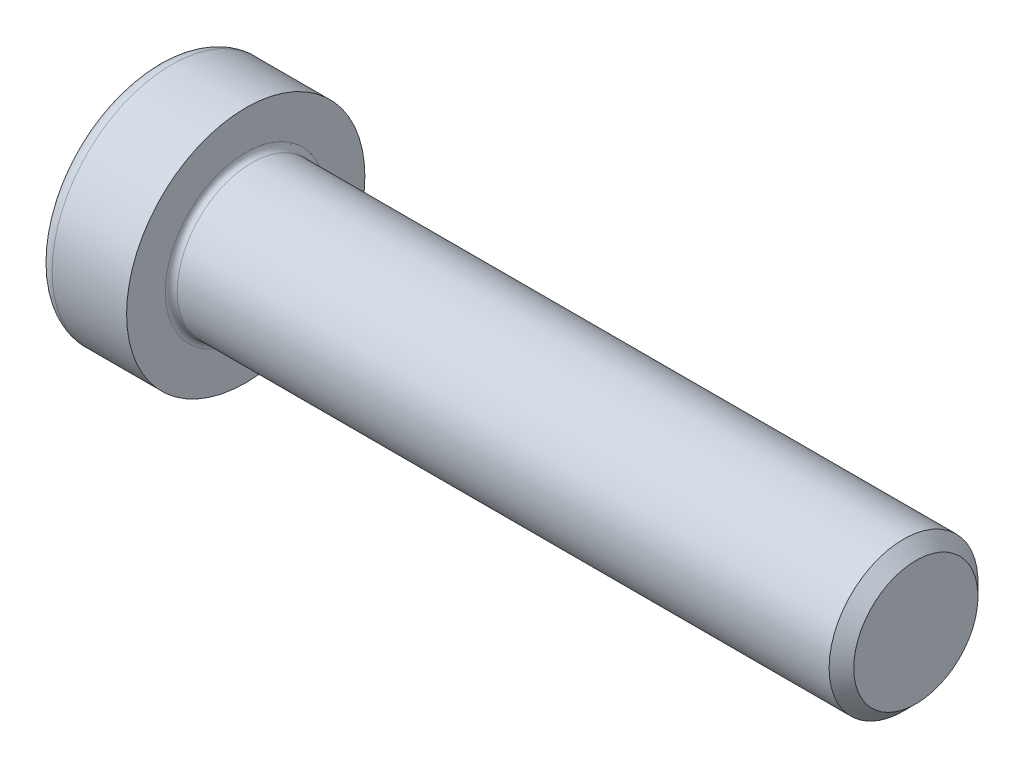
ISO-10303-21;
HEADER;
FILE_DESCRIPTION(('STEP AP214'),'2;1');
FILE_NAME('part.step','',(''),(''),'','','');
FILE_SCHEMA(('AUTOMOTIVE_DESIGN { 1 0 10303 214 1 1 1 1 }'));
ENDSEC;
DATA;
#1=APPLICATION_CONTEXT('core data for automotive mechanical design processes');
#2=APPLICATION_PROTOCOL_DEFINITION('international standard','automotive_design',2000,#1);
#3=PRODUCT_CONTEXT('',#1,'mechanical');
#4=PRODUCT('Part','Part','',(#3));
#5=PRODUCT_RELATED_PRODUCT_CATEGORY('part','',(#4));
#6=PRODUCT_DEFINITION_FORMATION('','',#4);
#7=PRODUCT_DEFINITION_CONTEXT('part definition',#1,'design');
#8=PRODUCT_DEFINITION('design','',#6,#7);
#9=PRODUCT_DEFINITION_SHAPE('','',#8);
#10=(LENGTH_UNIT() NAMED_UNIT(*) SI_UNIT(.MILLI.,.METRE.));
#11=(NAMED_UNIT(*) PLANE_ANGLE_UNIT() SI_UNIT($,.RADIAN.));
#12=(NAMED_UNIT(*) SI_UNIT($,.STERADIAN.) SOLID_ANGLE_UNIT());
#13=UNCERTAINTY_MEASURE_WITH_UNIT(LENGTH_MEASURE(1.E-05),#10,'distance_accuracy_value','');
#14=(GEOMETRIC_REPRESENTATION_CONTEXT(3) GLOBAL_UNCERTAINTY_ASSIGNED_CONTEXT((#13)) GLOBAL_UNIT_ASSIGNED_CONTEXT((#10,
#11,#12)) REPRESENTATION_CONTEXT('',''));
#15=CARTESIAN_POINT('',(0.,0.,0.));
#16=DIRECTION('',(0.,0.,1.));
#17=DIRECTION('',(1.,0.,0.));
#18=AXIS2_PLACEMENT_3D('',#15,#16,#17);
#19=CARTESIAN_POINT('',(0.,0.,0.));
#20=DIRECTION('',(-1.,0.,0.));
#21=DIRECTION('',(0.,0.,1.));
#22=AXIS2_PLACEMENT_3D('',#19,#20,#21);
#23=PLANE('',#22);
#24=DIRECTION('',(0.,-0.499999999999997,0.86602540378444));
#25=VECTOR('',#24,1.);
#26=CARTESIAN_POINT('',(0.,4.04145188432738,0.));
#27=LINE('',#26,#25);
#28=CARTESIAN_POINT('',(0.,4.04145188432738,0.));
#29=VERTEX_POINT('',#28);
#30=CARTESIAN_POINT('',(0.,2.0207259421637,3.49999999999999));
#31=VERTEX_POINT('',#30);
#32=EDGE_CURVE('E303',#29,#31,#27,.T.);
#33=ORIENTED_EDGE('',*,*,#32,.T.);
#34=DIRECTION('',(0.,1.,0.));
#35=VECTOR('',#34,1.);
#36=CARTESIAN_POINT('',(0.,-2.02072594216367,3.5));
#37=LINE('',#36,#35);
#38=CARTESIAN_POINT('',(0.,-2.02072594216367,3.5));
#39=VERTEX_POINT('',#38);
#40=EDGE_CURVE('E144',#39,#31,#37,.T.);
#41=ORIENTED_EDGE('',*,*,#40,.F.);
#42=DIRECTION('',(0.,-0.500000000000001,-0.866025403784438));
#43=VECTOR('',#42,1.);
#44=CARTESIAN_POINT('',(0.,-2.02072594216367,3.5));
#45=LINE('',#44,#43);
#46=CARTESIAN_POINT('',(0.,-4.04145188432737,0.));
#47=VERTEX_POINT('',#46);
#48=EDGE_CURVE('E308',#39,#47,#45,.T.);
#49=ORIENTED_EDGE('',*,*,#48,.T.);
#50=DIRECTION('',(0.,0.499999999999997,-0.86602540378444));
#51=VECTOR('',#50,1.);
#52=CARTESIAN_POINT('',(0.,-4.04145188432737,0.));
#53=LINE('',#52,#51);
#54=CARTESIAN_POINT('',(0.,-2.02072594216369,-3.5));
#55=VERTEX_POINT('',#54);
#56=EDGE_CURVE('E312',#47,#55,#53,.T.);
#57=ORIENTED_EDGE('',*,*,#56,.T.);
#58=DIRECTION('',(0.,-1.,0.));
#59=VECTOR('',#58,1.);
#60=CARTESIAN_POINT('',(0.,2.02072594216369,-3.50000000000001));
#61=LINE('',#60,#59);
#62=CARTESIAN_POINT('',(0.,2.02072594216369,-3.50000000000001));
#63=VERTEX_POINT('',#62);
#64=EDGE_CURVE('E316',#63,#55,#61,.T.);
#65=ORIENTED_EDGE('',*,*,#64,.F.);
#66=DIRECTION('',(0.,-0.500000000000001,-0.866025403784438));
#67=VECTOR('',#66,1.);
#68=CARTESIAN_POINT('',(0.,4.04145188432738,0.));
#69=LINE('',#68,#67);
#70=EDGE_CURVE('E139',#29,#63,#69,.T.);
#71=ORIENTED_EDGE('',*,*,#70,.F.);
#72=EDGE_LOOP('',(#33,#41,#49,#57,#65,#71));
#73=FACE_BOUND('',#72,.T.);
#74=CARTESIAN_POINT('',(0.,0.,0.));
#75=DIRECTION('',(-1.,0.,0.));
#76=DIRECTION('',(0.,0.,1.));
#77=AXIS2_PLACEMENT_3D('',#74,#75,#76);
#78=CIRCLE('',#77,7.);
#79=CARTESIAN_POINT('',(0.,0.,7.));
#80=VERTEX_POINT('',#79);
#81=EDGE_CURVE('E58',#80,#80,#78,.T.);
#82=ORIENTED_EDGE('',*,*,#81,.T.);
#83=EDGE_LOOP('',(#82));
#84=FACE_BOUND('',#83,.T.);
#85=ADVANCED_FACE('F49',(#73,#84),#23,.T.);
#86=CARTESIAN_POINT('',(-31.75,0.,0.));
#87=DIRECTION('',(-1.,0.,0.));
#88=DIRECTION('',(0.,0.,1.));
#89=AXIS2_PLACEMENT_3D('',#86,#87,#88);
#90=CYLINDRICAL_SURFACE('',#89,8.);
#91=CARTESIAN_POINT('',(1.,0.,0.));
#92=DIRECTION('',(-1.,0.,0.));
#93=DIRECTION('',(0.,0.,1.));
#94=AXIS2_PLACEMENT_3D('',#91,#92,#93);
#95=CIRCLE('',#94,8.);
#96=CARTESIAN_POINT('',(1.,0.,8.));
#97=VERTEX_POINT('',#96);
#98=EDGE_CURVE('E11',#97,#97,#95,.F.);
#99=ORIENTED_EDGE('',*,*,#98,.T.);
#100=EDGE_LOOP('',(#99));
#101=FACE_BOUND('',#100,.T.);
#102=CARTESIAN_POINT('',(6.,0.,0.));
#103=DIRECTION('',(-1.,0.,0.));
#104=DIRECTION('',(0.,0.,1.));
#105=AXIS2_PLACEMENT_3D('',#102,#103,#104);
#106=CIRCLE('',#105,8.);
#107=CARTESIAN_POINT('',(6.,0.,8.));
#108=VERTEX_POINT('',#107);
#109=EDGE_CURVE('E169',#108,#108,#106,.T.);
#110=ORIENTED_EDGE('',*,*,#109,.T.);
#111=EDGE_LOOP('',(#110));
#112=FACE_BOUND('',#111,.T.);
#113=ADVANCED_FACE('F199',(#101,#112),#90,.T.);
#114=CARTESIAN_POINT('',(6.,8.,0.));
#115=DIRECTION('',(1.,0.,0.));
#116=DIRECTION('',(0.,0.,-1.));
#117=AXIS2_PLACEMENT_3D('',#114,#115,#116);
#118=PLANE('',#117);
#119=CARTESIAN_POINT('',(6.,0.,0.));
#120=DIRECTION('',(1.,0.,0.));
#121=DIRECTION('',(0.,0.,-1.));
#122=AXIS2_PLACEMENT_3D('',#119,#120,#121);
#123=CIRCLE('',#122,5.4);
#124=CARTESIAN_POINT('',(6.,0.,-5.4));
#125=VERTEX_POINT('',#124);
#126=EDGE_CURVE('E173',#125,#125,#123,.F.);
#127=ORIENTED_EDGE('',*,*,#126,.T.);
#128=EDGE_LOOP('',(#127));
#129=FACE_BOUND('',#128,.T.);
#130=ORIENTED_EDGE('',*,*,#109,.F.);
#131=EDGE_LOOP('',(#130));
#132=FACE_BOUND('',#131,.T.);
#133=ADVANCED_FACE('F204',(#129,#132),#118,.T.);
#134=CARTESIAN_POINT('',(-31.75,0.,0.));
#135=DIRECTION('',(-1.,0.,0.));
#136=DIRECTION('',(0.,0.,1.));
#137=AXIS2_PLACEMENT_3D('',#134,#135,#136);
#138=CYLINDRICAL_SURFACE('',#137,5.);
#139=CARTESIAN_POINT('',(6.4,0.,0.));
#140=DIRECTION('',(1.,0.,0.));
#141=DIRECTION('',(0.,0.,-1.));
#142=AXIS2_PLACEMENT_3D('',#139,#140,#141);
#143=CIRCLE('',#142,5.);
#144=CARTESIAN_POINT('',(6.4,0.,-5.));
#145=VERTEX_POINT('',#144);
#146=EDGE_CURVE('E177',#145,#145,#143,.T.);
#147=ORIENTED_EDGE('',*,*,#146,.T.);
#148=EDGE_LOOP('',(#147));
#149=FACE_BOUND('',#148,.T.);
#150=CARTESIAN_POINT('',(50.172,0.,0.));
#151=DIRECTION('',(-1.,0.,0.));
#152=DIRECTION('',(0.,0.,1.));
#153=AXIS2_PLACEMENT_3D('',#150,#151,#152);
#154=CIRCLE('',#153,5.);
#155=CARTESIAN_POINT('',(50.172,0.,5.));
#156=VERTEX_POINT('',#155);
#157=EDGE_CURVE('E165',#156,#156,#154,.T.);
#158=ORIENTED_EDGE('',*,*,#157,.T.);
#159=EDGE_LOOP('',(#158));
#160=FACE_BOUND('',#159,.T.);
#161=ADVANCED_FACE('F210',(#149,#160),#138,.T.);
#162=CARTESIAN_POINT('',(51.,0.,0.));
#163=DIRECTION('',(-1.,0.,0.));
#164=DIRECTION('',(0.,0.,1.));
#165=AXIS2_PLACEMENT_3D('',#162,#163,#164);
#166=CONICAL_SURFACE('',#165,4.172,0.785398163397442);
#167=ORIENTED_EDGE('',*,*,#157,.F.);
#168=EDGE_LOOP('',(#167));
#169=FACE_BOUND('',#168,.T.);
#170=CARTESIAN_POINT('',(51.,0.,0.));
#171=DIRECTION('',(-1.,0.,0.));
#172=DIRECTION('',(0.,0.,1.));
#173=AXIS2_PLACEMENT_3D('',#170,#171,#172);
#174=CIRCLE('',#173,4.172);
#175=CARTESIAN_POINT('',(51.,0.,4.172));
#176=VERTEX_POINT('',#175);
#177=EDGE_CURVE('E160',#176,#176,#174,.T.);
#178=ORIENTED_EDGE('',*,*,#177,.T.);
#179=EDGE_LOOP('',(#178));
#180=FACE_BOUND('',#179,.T.);
#181=ADVANCED_FACE('F214',(#169,#180),#166,.T.);
#182=CARTESIAN_POINT('',(51.,4.172,0.));
#183=DIRECTION('',(1.,0.,0.));
#184=DIRECTION('',(0.,0.,-1.));
#185=AXIS2_PLACEMENT_3D('',#182,#183,#184);
#186=PLANE('',#185);
#187=ORIENTED_EDGE('',*,*,#177,.F.);
#188=EDGE_LOOP('',(#187));
#189=FACE_BOUND('',#188,.T.);
#190=ADVANCED_FACE('F196',(#189),#186,.T.);
#191=CARTESIAN_POINT('',(6.4,0.,0.));
#192=DIRECTION('',(1.,0.,0.));
#193=DIRECTION('',(0.,0.,-1.));
#194=AXIS2_PLACEMENT_3D('',#191,#192,#193);
#195=TOROIDAL_SURFACE('',#194,5.4,0.4);
#196=ORIENTED_EDGE('',*,*,#146,.F.);
#197=EDGE_LOOP('',(#196));
#198=FACE_BOUND('',#197,.T.);
#199=ORIENTED_EDGE('',*,*,#126,.F.);
#200=EDGE_LOOP('',(#199));
#201=FACE_BOUND('',#200,.T.);
#202=ADVANCED_FACE('F187',(#198,#201),#195,.F.);
#203=CARTESIAN_POINT('',(1.,0.,0.));
#204=DIRECTION('',(-1.,0.,0.));
#205=DIRECTION('',(0.,0.,1.));
#206=AXIS2_PLACEMENT_3D('',#203,#204,#205);
#207=TOROIDAL_SURFACE('',#206,7.,1.);
#208=ORIENTED_EDGE('',*,*,#98,.F.);
#209=EDGE_LOOP('',(#208));
#210=FACE_BOUND('',#209,.T.);
#211=ORIENTED_EDGE('',*,*,#81,.F.);
#212=EDGE_LOOP('',(#211));
#213=FACE_BOUND('',#212,.T.);
#214=ADVANCED_FACE('F51',(#210,#213),#207,.T.);
#215=CARTESIAN_POINT('',(4.5,4.04145188432738,0.));
#216=DIRECTION('',(0.,-0.86602540378444,-0.499999999999997));
#217=DIRECTION('',(0.,0.499999999999997,-0.86602540378444));
#218=AXIS2_PLACEMENT_3D('',#215,#216,#217);
#219=PLANE('',#218);
#220=ORIENTED_EDGE('',*,*,#32,.F.);
#221=DIRECTION('',(-1.,0.,0.));
#222=VECTOR('',#221,1.);
#223=CARTESIAN_POINT('',(4.5,4.04145188432738,0.));
#224=LINE('',#223,#222);
#225=CARTESIAN_POINT('',(4.5,4.04145188432738,0.));
#226=VERTEX_POINT('',#225);
#227=EDGE_CURVE('E302',#226,#29,#224,.T.);
#228=ORIENTED_EDGE('',*,*,#227,.F.);
#229=DIRECTION('',(0.,-0.499999999999997,0.86602540378444));
#230=VECTOR('',#229,1.);
#231=CARTESIAN_POINT('',(4.5,4.04145188432738,0.));
#232=LINE('',#231,#230);
#233=CARTESIAN_POINT('',(4.5,3.03108891324554,1.74999999999999));
#234=VERTEX_POINT('',#233);
#235=EDGE_CURVE('E65',#226,#234,#232,.T.);
#236=ORIENTED_EDGE('',*,*,#235,.T.);
#237=CARTESIAN_POINT('',(4.5,2.0207259421637,3.49999999999999));
#238=VERTEX_POINT('',#237);
#239=EDGE_CURVE('E123',#234,#238,#232,.T.);
#240=ORIENTED_EDGE('',*,*,#239,.T.);
#241=DIRECTION('',(-1.,0.,0.));
#242=VECTOR('',#241,1.);
#243=CARTESIAN_POINT('',(4.5,2.0207259421637,3.49999999999999));
#244=LINE('',#243,#242);
#245=EDGE_CURVE('E136',#238,#31,#244,.T.);
#246=ORIENTED_EDGE('',*,*,#245,.T.);
#247=EDGE_LOOP('',(#220,#228,#236,#240,#246));
#248=FACE_BOUND('',#247,.T.);
#249=ADVANCED_FACE('F135',(#248),#219,.T.);
#250=CARTESIAN_POINT('',(4.5,-2.02072594216367,3.5));
#251=DIRECTION('',(0.,0.,1.));
#252=DIRECTION('',(0.,-1.,0.));
#253=AXIS2_PLACEMENT_3D('',#250,#251,#252);
#254=PLANE('',#253);
#255=ORIENTED_EDGE('',*,*,#40,.T.);
#256=ORIENTED_EDGE('',*,*,#245,.F.);
#257=DIRECTION('',(0.,1.,0.));
#258=VECTOR('',#257,1.);
#259=CARTESIAN_POINT('',(4.5,-2.02072594216367,3.5));
#260=LINE('',#259,#258);
#261=CARTESIAN_POINT('',(4.5,0.,3.49999999999999));
#262=VERTEX_POINT('',#261);
#263=EDGE_CURVE('E121',#262,#238,#260,.T.);
#264=ORIENTED_EDGE('',*,*,#263,.F.);
#265=CARTESIAN_POINT('',(4.5,-2.02072594216367,3.5));
#266=VERTEX_POINT('',#265);
#267=EDGE_CURVE('E132',#266,#262,#260,.T.);
#268=ORIENTED_EDGE('',*,*,#267,.F.);
#269=DIRECTION('',(-1.,0.,0.));
#270=VECTOR('',#269,1.);
#271=CARTESIAN_POINT('',(4.5,-2.02072594216367,3.5));
#272=LINE('',#271,#270);
#273=EDGE_CURVE('E147',#266,#39,#272,.T.);
#274=ORIENTED_EDGE('',*,*,#273,.T.);
#275=EDGE_LOOP('',(#255,#256,#264,#268,#274));
#276=FACE_BOUND('',#275,.T.);
#277=ADVANCED_FACE('F141',(#276),#254,.F.);
#278=CARTESIAN_POINT('',(4.5,-2.02072594216367,3.5));
#279=DIRECTION('',(0.,0.866025403784438,-0.500000000000001));
#280=DIRECTION('',(0.,0.500000000000001,0.866025403784438));
#281=AXIS2_PLACEMENT_3D('',#278,#279,#280);
#282=PLANE('',#281);
#283=ORIENTED_EDGE('',*,*,#48,.F.);
#284=ORIENTED_EDGE('',*,*,#273,.F.);
#285=DIRECTION('',(0.,-0.500000000000001,-0.866025403784438));
#286=VECTOR('',#285,1.);
#287=CARTESIAN_POINT('',(4.5,-2.02072594216367,3.5));
#288=LINE('',#287,#286);
#289=CARTESIAN_POINT('',(4.5,-3.03108891324552,1.75));
#290=VERTEX_POINT('',#289);
#291=EDGE_CURVE('E276',#266,#290,#288,.T.);
#292=ORIENTED_EDGE('',*,*,#291,.T.);
#293=CARTESIAN_POINT('',(4.5,-4.04145188432737,0.));
#294=VERTEX_POINT('',#293);
#295=EDGE_CURVE('E278',#290,#294,#288,.T.);
#296=ORIENTED_EDGE('',*,*,#295,.T.);
#297=DIRECTION('',(-1.,0.,0.));
#298=VECTOR('',#297,1.);
#299=CARTESIAN_POINT('',(4.5,-4.04145188432737,0.));
#300=LINE('',#299,#298);
#301=EDGE_CURVE('E155',#294,#47,#300,.T.);
#302=ORIENTED_EDGE('',*,*,#301,.T.);
#303=EDGE_LOOP('',(#283,#284,#292,#296,#302));
#304=FACE_BOUND('',#303,.T.);
#305=ADVANCED_FACE('F227',(#304),#282,.T.);
#306=CARTESIAN_POINT('',(4.5,-4.04145188432737,0.));
#307=DIRECTION('',(0.,0.86602540378444,0.499999999999997));
#308=DIRECTION('',(0.,-0.499999999999998,0.86602540378444));
#309=AXIS2_PLACEMENT_3D('',#306,#307,#308);
#310=PLANE('',#309);
#311=ORIENTED_EDGE('',*,*,#56,.F.);
#312=ORIENTED_EDGE('',*,*,#301,.F.);
#313=DIRECTION('',(0.,0.499999999999997,-0.86602540378444));
#314=VECTOR('',#313,1.);
#315=CARTESIAN_POINT('',(4.5,-4.04145188432737,0.));
#316=LINE('',#315,#314);
#317=CARTESIAN_POINT('',(4.5,-3.03108891324554,-1.74999999999999));
#318=VERTEX_POINT('',#317);
#319=EDGE_CURVE('E281',#294,#318,#316,.T.);
#320=ORIENTED_EDGE('',*,*,#319,.T.);
#321=CARTESIAN_POINT('',(4.5,-2.02072594216369,-3.5));
#322=VERTEX_POINT('',#321);
#323=EDGE_CURVE('E287',#318,#322,#316,.T.);
#324=ORIENTED_EDGE('',*,*,#323,.T.);
#325=DIRECTION('',(-1.,0.,0.));
#326=VECTOR('',#325,1.);
#327=CARTESIAN_POINT('',(4.5,-2.02072594216369,-3.5));
#328=LINE('',#327,#326);
#329=EDGE_CURVE('E329',#322,#55,#328,.T.);
#330=ORIENTED_EDGE('',*,*,#329,.T.);
#331=EDGE_LOOP('',(#311,#312,#320,#324,#330));
#332=FACE_BOUND('',#331,.T.);
#333=ADVANCED_FACE('F230',(#332),#310,.T.);
#334=CARTESIAN_POINT('',(4.5,2.02072594216369,-3.50000000000001));
#335=DIRECTION('',(0.,0.,-1.));
#336=DIRECTION('',(0.,1.,0.));
#337=AXIS2_PLACEMENT_3D('',#334,#335,#336);
#338=PLANE('',#337);
#339=ORIENTED_EDGE('',*,*,#64,.T.);
#340=ORIENTED_EDGE('',*,*,#329,.F.);
#341=DIRECTION('',(0.,-1.,0.));
#342=VECTOR('',#341,1.);
#343=CARTESIAN_POINT('',(4.5,2.02072594216369,-3.50000000000001));
#344=LINE('',#343,#342);
#345=CARTESIAN_POINT('',(4.5,0.,-3.5));
#346=VERTEX_POINT('',#345);
#347=EDGE_CURVE('E294',#346,#322,#344,.T.);
#348=ORIENTED_EDGE('',*,*,#347,.F.);
#349=CARTESIAN_POINT('',(4.5,2.02072594216369,-3.50000000000001));
#350=VERTEX_POINT('',#349);
#351=EDGE_CURVE('E295',#350,#346,#344,.T.);
#352=ORIENTED_EDGE('',*,*,#351,.F.);
#353=DIRECTION('',(-1.,0.,0.));
#354=VECTOR('',#353,1.);
#355=CARTESIAN_POINT('',(4.5,2.02072594216369,-3.50000000000001));
#356=LINE('',#355,#354);
#357=EDGE_CURVE('E325',#350,#63,#356,.T.);
#358=ORIENTED_EDGE('',*,*,#357,.T.);
#359=EDGE_LOOP('',(#339,#340,#348,#352,#358));
#360=FACE_BOUND('',#359,.T.);
#361=ADVANCED_FACE('F234',(#360),#338,.F.);
#362=CARTESIAN_POINT('',(4.5,4.04145188432738,0.));
#363=DIRECTION('',(0.,0.866025403784438,-0.500000000000001));
#364=DIRECTION('',(0.,0.500000000000001,0.866025403784438));
#365=AXIS2_PLACEMENT_3D('',#362,#363,#364);
#366=PLANE('',#365);
#367=ORIENTED_EDGE('',*,*,#70,.T.);
#368=ORIENTED_EDGE('',*,*,#357,.F.);
#369=DIRECTION('',(0.,-0.500000000000001,-0.866025403784438));
#370=VECTOR('',#369,1.);
#371=CARTESIAN_POINT('',(4.5,4.04145188432738,0.));
#372=LINE('',#371,#370);
#373=CARTESIAN_POINT('',(4.5,3.03108891324554,-1.75000000000001));
#374=VERTEX_POINT('',#373);
#375=EDGE_CURVE('E299',#374,#350,#372,.T.);
#376=ORIENTED_EDGE('',*,*,#375,.F.);
#377=EDGE_CURVE('E266',#226,#374,#372,.T.);
#378=ORIENTED_EDGE('',*,*,#377,.F.);
#379=ORIENTED_EDGE('',*,*,#227,.T.);
#380=EDGE_LOOP('',(#367,#368,#376,#378,#379));
#381=FACE_BOUND('',#380,.T.);
#382=ADVANCED_FACE('F238',(#381),#366,.F.);
#383=CARTESIAN_POINT('',(4.5,2.0207259421637,3.49999999999999));
#384=DIRECTION('',(-1.,0.,0.));
#385=DIRECTION('',(0.,0.,1.));
#386=AXIS2_PLACEMENT_3D('',#383,#384,#385);
#387=PLANE('',#386);
#388=CARTESIAN_POINT('',(4.5,0.,0.));
#389=DIRECTION('',(-1.,0.,0.));
#390=DIRECTION('',(0.,0.,1.));
#391=AXIS2_PLACEMENT_3D('',#388,#389,#390);
#392=CIRCLE('',#391,3.5);
#393=EDGE_CURVE('E146',#290,#262,#392,.T.);
#394=ORIENTED_EDGE('',*,*,#393,.F.);
#395=ORIENTED_EDGE('',*,*,#291,.F.);
#396=ORIENTED_EDGE('',*,*,#267,.T.);
#397=EDGE_LOOP('',(#394,#395,#396));
#398=FACE_BOUND('',#397,.T.);
#399=ADVANCED_FACE('F242',(#398),#387,.T.);
#400=EDGE_CURVE('E153',#318,#290,#392,.T.);
#401=ORIENTED_EDGE('',*,*,#400,.F.);
#402=ORIENTED_EDGE('',*,*,#319,.F.);
#403=ORIENTED_EDGE('',*,*,#295,.F.);
#404=EDGE_LOOP('',(#401,#402,#403));
#405=FACE_BOUND('',#404,.T.);
#406=ADVANCED_FACE('F245',(#405),#387,.T.);
#407=EDGE_CURVE('E348',#346,#318,#392,.T.);
#408=ORIENTED_EDGE('',*,*,#407,.F.);
#409=ORIENTED_EDGE('',*,*,#347,.T.);
#410=ORIENTED_EDGE('',*,*,#323,.F.);
#411=EDGE_LOOP('',(#408,#409,#410));
#412=FACE_BOUND('',#411,.T.);
#413=ADVANCED_FACE('F250',(#412),#387,.T.);
#414=EDGE_CURVE('E270',#374,#346,#392,.T.);
#415=ORIENTED_EDGE('',*,*,#414,.F.);
#416=ORIENTED_EDGE('',*,*,#375,.T.);
#417=ORIENTED_EDGE('',*,*,#351,.T.);
#418=EDGE_LOOP('',(#415,#416,#417));
#419=FACE_BOUND('',#418,.T.);
#420=ADVANCED_FACE('F257',(#419),#387,.T.);
#421=EDGE_CURVE('E161',#234,#374,#392,.T.);
#422=ORIENTED_EDGE('',*,*,#421,.F.);
#423=ORIENTED_EDGE('',*,*,#235,.F.);
#424=ORIENTED_EDGE('',*,*,#377,.T.);
#425=EDGE_LOOP('',(#422,#423,#424));
#426=FACE_BOUND('',#425,.T.);
#427=ADVANCED_FACE('F253',(#426),#387,.T.);
#428=EDGE_CURVE('E126',#262,#234,#392,.T.);
#429=ORIENTED_EDGE('',*,*,#428,.F.);
#430=ORIENTED_EDGE('',*,*,#263,.T.);
#431=ORIENTED_EDGE('',*,*,#239,.F.);
#432=EDGE_LOOP('',(#429,#430,#431));
#433=FACE_BOUND('',#432,.T.);
#434=ADVANCED_FACE('F122',(#433),#387,.T.);
#435=CARTESIAN_POINT('',(4.5,0.,0.));
#436=DIRECTION('',(-1.,0.,0.));
#437=DIRECTION('',(0.,0.,1.));
#438=AXIS2_PLACEMENT_3D('',#435,#436,#437);
#439=CONICAL_SURFACE('',#438,3.5,1.04719755119659);
#440=CARTESIAN_POINT('',(6.52072594216371,0.,0.));
#441=VERTEX_POINT('',#440);
#442=VERTEX_LOOP('',#441);
#443=FACE_BOUND('',#442,.T.);
#444=ORIENTED_EDGE('',*,*,#428,.T.);
#445=ORIENTED_EDGE('',*,*,#421,.T.);
#446=ORIENTED_EDGE('',*,*,#414,.T.);
#447=ORIENTED_EDGE('',*,*,#407,.T.);
#448=ORIENTED_EDGE('',*,*,#400,.T.);
#449=ORIENTED_EDGE('',*,*,#393,.T.);
#450=EDGE_LOOP('',(#444,#445,#446,#447,#448,#449));
#451=FACE_BOUND('',#450,.T.);
#452=ADVANCED_FACE('F222',(#443,#451),#439,.F.);
#453=CLOSED_SHELL('',(#85,#113,#133,#161,#181,#190,#202,#214,#249,#277,#305,#333,#361,#382,#399,
#406,#413,#420,#427,#434,#452));
#454=MANIFOLD_SOLID_BREP('B2',#453);
#455=ADVANCED_BREP_SHAPE_REPRESENTATION('',(#18,#454),#14);
#456=SHAPE_DEFINITION_REPRESENTATION(#9,#455);
ENDSEC;
END-ISO-10303-21;
